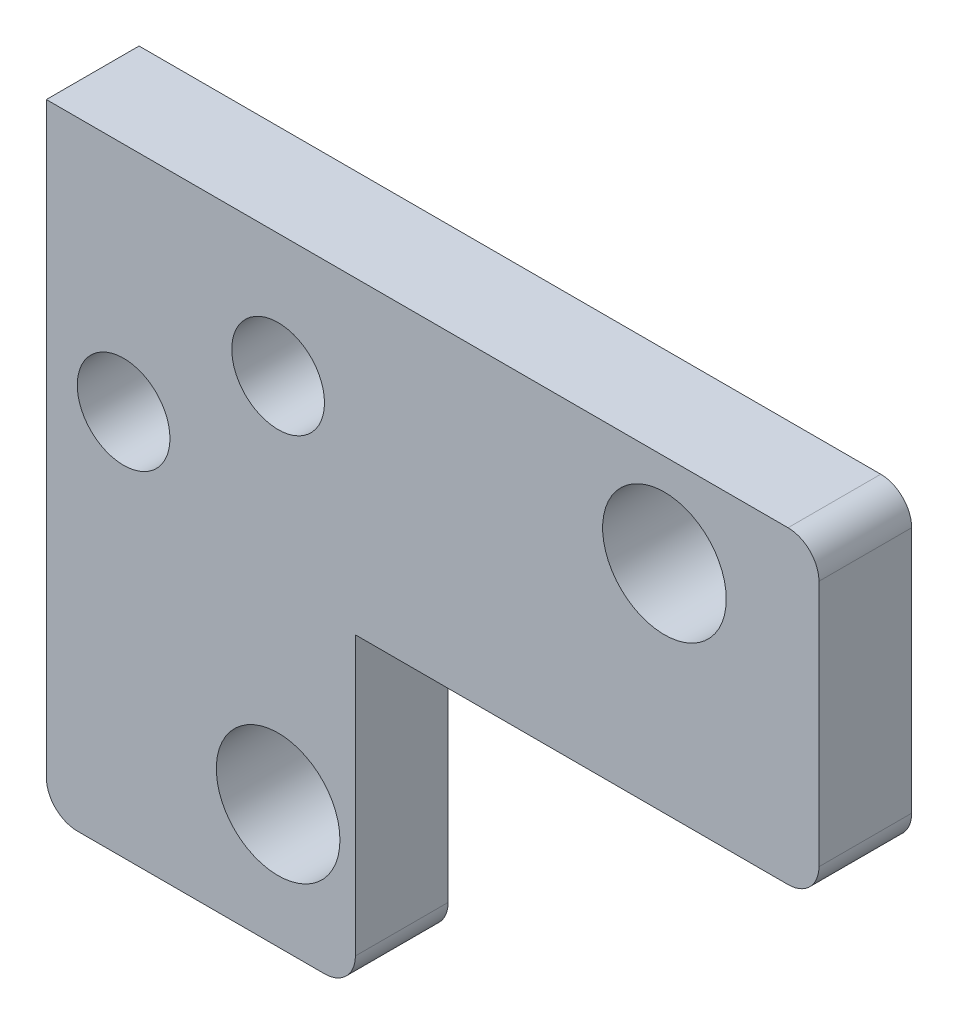
ISO-10303-21;
HEADER;
FILE_DESCRIPTION(('STEP AP214'),'2;1');
FILE_NAME('part.step','',(''),(''),'','','');
FILE_SCHEMA(('AUTOMOTIVE_DESIGN { 1 0 10303 214 1 1 1 1 }'));
ENDSEC;
DATA;
#1=APPLICATION_CONTEXT('core data for automotive mechanical design processes');
#2=APPLICATION_PROTOCOL_DEFINITION('international standard','automotive_design',2000,#1);
#3=PRODUCT_CONTEXT('',#1,'mechanical');
#4=PRODUCT('Part','Part','',(#3));
#5=PRODUCT_RELATED_PRODUCT_CATEGORY('part','',(#4));
#6=PRODUCT_DEFINITION_FORMATION('','',#4);
#7=PRODUCT_DEFINITION_CONTEXT('part definition',#1,'design');
#8=PRODUCT_DEFINITION('design','',#6,#7);
#9=PRODUCT_DEFINITION_SHAPE('','',#8);
#10=(LENGTH_UNIT() NAMED_UNIT(*) SI_UNIT(.MILLI.,.METRE.));
#11=(NAMED_UNIT(*) PLANE_ANGLE_UNIT() SI_UNIT($,.RADIAN.));
#12=(NAMED_UNIT(*) SI_UNIT($,.STERADIAN.) SOLID_ANGLE_UNIT());
#13=UNCERTAINTY_MEASURE_WITH_UNIT(LENGTH_MEASURE(1.E-05),#10,'distance_accuracy_value','');
#14=(GEOMETRIC_REPRESENTATION_CONTEXT(3) GLOBAL_UNCERTAINTY_ASSIGNED_CONTEXT((#13)) GLOBAL_UNIT_ASSIGNED_CONTEXT((#10,
#11,#12)) REPRESENTATION_CONTEXT('',''));
#15=CARTESIAN_POINT('',(0.,0.,0.));
#16=DIRECTION('',(0.,0.,1.));
#17=DIRECTION('',(1.,0.,0.));
#18=AXIS2_PLACEMENT_3D('',#15,#16,#17);
#19=CARTESIAN_POINT('',(0.,0.,3.));
#20=DIRECTION('',(0.,1.,0.));
#21=DIRECTION('',(0.,0.,1.));
#22=AXIS2_PLACEMENT_3D('',#19,#20,#21);
#23=PLANE('',#22);
#24=DIRECTION('',(1.,0.,0.));
#25=VECTOR('',#24,1.);
#26=CARTESIAN_POINT('',(0.,0.,0.));
#27=LINE('',#26,#25);
#28=CARTESIAN_POINT('',(10.,0.,0.));
#29=VERTEX_POINT('',#28);
#30=CARTESIAN_POINT('',(24.,0.,0.));
#31=VERTEX_POINT('',#30);
#32=EDGE_CURVE('E163',#29,#31,#27,.T.);
#33=ORIENTED_EDGE('',*,*,#32,.T.);
#34=DIRECTION('',(0.,0.,-1.));
#35=VECTOR('',#34,1.);
#36=CARTESIAN_POINT('',(24.,0.,3.));
#37=LINE('',#36,#35);
#38=CARTESIAN_POINT('',(24.,0.,3.));
#39=VERTEX_POINT('',#38);
#40=EDGE_CURVE('E11',#31,#39,#37,.F.);
#41=ORIENTED_EDGE('',*,*,#40,.T.);
#42=DIRECTION('',(1.,0.,0.));
#43=VECTOR('',#42,1.);
#44=CARTESIAN_POINT('',(0.,0.,3.));
#45=LINE('',#44,#43);
#46=CARTESIAN_POINT('',(10.,0.,3.));
#47=VERTEX_POINT('',#46);
#48=EDGE_CURVE('E116',#47,#39,#45,.T.);
#49=ORIENTED_EDGE('',*,*,#48,.F.);
#50=DIRECTION('',(0.,0.,1.));
#51=VECTOR('',#50,1.);
#52=CARTESIAN_POINT('',(10.,0.,0.));
#53=LINE('',#52,#51);
#54=EDGE_CURVE('E126',#29,#47,#53,.T.);
#55=ORIENTED_EDGE('',*,*,#54,.F.);
#56=EDGE_LOOP('',(#33,#41,#49,#55));
#57=FACE_BOUND('',#56,.T.);
#58=ADVANCED_FACE('F35',(#57),#23,.F.);
#59=CARTESIAN_POINT('',(0.,0.,3.));
#60=DIRECTION('',(1.,0.,0.));
#61=DIRECTION('',(0.,1.,0.));
#62=AXIS2_PLACEMENT_3D('',#59,#60,#61);
#63=PLANE('',#62);
#64=DIRECTION('',(0.,-1.,0.));
#65=VECTOR('',#64,1.);
#66=CARTESIAN_POINT('',(0.,0.,0.));
#67=LINE('',#66,#65);
#68=CARTESIAN_POINT('',(0.,10.,0.));
#69=VERTEX_POINT('',#68);
#70=CARTESIAN_POINT('',(0.,-9.,0.));
#71=VERTEX_POINT('',#70);
#72=EDGE_CURVE('E151',#69,#71,#67,.T.);
#73=ORIENTED_EDGE('',*,*,#72,.T.);
#74=DIRECTION('',(0.,0.,1.));
#75=VECTOR('',#74,1.);
#76=CARTESIAN_POINT('',(0.,-9.,3.));
#77=LINE('',#76,#75);
#78=CARTESIAN_POINT('',(0.,-9.,3.));
#79=VERTEX_POINT('',#78);
#80=EDGE_CURVE('E171',#71,#79,#77,.T.);
#81=ORIENTED_EDGE('',*,*,#80,.T.);
#82=DIRECTION('',(0.,-1.,0.));
#83=VECTOR('',#82,1.);
#84=CARTESIAN_POINT('',(0.,0.,3.));
#85=LINE('',#84,#83);
#86=CARTESIAN_POINT('',(0.,10.,3.));
#87=VERTEX_POINT('',#86);
#88=EDGE_CURVE('E129',#87,#79,#85,.T.);
#89=ORIENTED_EDGE('',*,*,#88,.F.);
#90=DIRECTION('',(0.,0.,-1.));
#91=VECTOR('',#90,1.);
#92=CARTESIAN_POINT('',(0.,10.,3.));
#93=LINE('',#92,#91);
#94=EDGE_CURVE('E160',#87,#69,#93,.T.);
#95=ORIENTED_EDGE('',*,*,#94,.T.);
#96=EDGE_LOOP('',(#73,#81,#89,#95));
#97=FACE_BOUND('',#96,.T.);
#98=ADVANCED_FACE('F221',(#97),#63,.F.);
#99=CARTESIAN_POINT('',(25.,0.,3.));
#100=DIRECTION('',(-1.,0.,0.));
#101=DIRECTION('',(0.,-1.,0.));
#102=AXIS2_PLACEMENT_3D('',#99,#100,#101);
#103=PLANE('',#102);
#104=DIRECTION('',(0.,1.,0.));
#105=VECTOR('',#104,1.);
#106=CARTESIAN_POINT('',(25.,0.,0.));
#107=LINE('',#106,#105);
#108=CARTESIAN_POINT('',(25.,1.,0.));
#109=VERTEX_POINT('',#108);
#110=CARTESIAN_POINT('',(25.,9.,0.));
#111=VERTEX_POINT('',#110);
#112=EDGE_CURVE('E165',#109,#111,#107,.T.);
#113=ORIENTED_EDGE('',*,*,#112,.T.);
#114=DIRECTION('',(0.,0.,-1.));
#115=VECTOR('',#114,1.);
#116=CARTESIAN_POINT('',(25.,9.,3.));
#117=LINE('',#116,#115);
#118=CARTESIAN_POINT('',(25.,9.,3.));
#119=VERTEX_POINT('',#118);
#120=EDGE_CURVE('E43',#111,#119,#117,.F.);
#121=ORIENTED_EDGE('',*,*,#120,.T.);
#122=DIRECTION('',(0.,1.,0.));
#123=VECTOR('',#122,1.);
#124=CARTESIAN_POINT('',(25.,0.,3.));
#125=LINE('',#124,#123);
#126=CARTESIAN_POINT('',(25.,1.,3.));
#127=VERTEX_POINT('',#126);
#128=EDGE_CURVE('E128',#127,#119,#125,.T.);
#129=ORIENTED_EDGE('',*,*,#128,.F.);
#130=DIRECTION('',(0.,0.,-1.));
#131=VECTOR('',#130,1.);
#132=CARTESIAN_POINT('',(25.,1.,3.));
#133=LINE('',#132,#131);
#134=EDGE_CURVE('E199',#127,#109,#133,.T.);
#135=ORIENTED_EDGE('',*,*,#134,.T.);
#136=EDGE_LOOP('',(#113,#121,#129,#135));
#137=FACE_BOUND('',#136,.T.);
#138=ADVANCED_FACE('F204',(#137),#103,.F.);
#139=CARTESIAN_POINT('',(0.,10.,3.));
#140=DIRECTION('',(0.,-1.,0.));
#141=DIRECTION('',(0.,0.,-1.));
#142=AXIS2_PLACEMENT_3D('',#139,#140,#141);
#143=PLANE('',#142);
#144=DIRECTION('',(-1.,0.,0.));
#145=VECTOR('',#144,1.);
#146=CARTESIAN_POINT('',(0.,10.,3.));
#147=LINE('',#146,#145);
#148=CARTESIAN_POINT('',(24.,10.,3.));
#149=VERTEX_POINT('',#148);
#150=EDGE_CURVE('E158',#149,#87,#147,.T.);
#151=ORIENTED_EDGE('',*,*,#150,.F.);
#152=DIRECTION('',(0.,0.,-1.));
#153=VECTOR('',#152,1.);
#154=CARTESIAN_POINT('',(24.,10.,3.));
#155=LINE('',#154,#153);
#156=CARTESIAN_POINT('',(24.,10.,0.));
#157=VERTEX_POINT('',#156);
#158=EDGE_CURVE('E196',#149,#157,#155,.T.);
#159=ORIENTED_EDGE('',*,*,#158,.T.);
#160=DIRECTION('',(-1.,0.,0.));
#161=VECTOR('',#160,1.);
#162=CARTESIAN_POINT('',(0.,10.,0.));
#163=LINE('',#162,#161);
#164=EDGE_CURVE('E154',#157,#69,#163,.T.);
#165=ORIENTED_EDGE('',*,*,#164,.T.);
#166=ORIENTED_EDGE('',*,*,#94,.F.);
#167=EDGE_LOOP('',(#151,#159,#165,#166));
#168=FACE_BOUND('',#167,.T.);
#169=ADVANCED_FACE('F213',(#168),#143,.F.);
#170=CARTESIAN_POINT('',(0.,0.,3.));
#171=DIRECTION('',(0.,0.,-1.));
#172=DIRECTION('',(-1.,0.,0.));
#173=AXIS2_PLACEMENT_3D('',#170,#171,#172);
#174=PLANE('',#173);
#175=CARTESIAN_POINT('',(7.5,-6.,3.));
#176=DIRECTION('',(0.,0.,1.));
#177=DIRECTION('',(1.,0.,0.));
#178=AXIS2_PLACEMENT_3D('',#175,#176,#177);
#179=CIRCLE('',#178,2.);
#180=CARTESIAN_POINT('',(9.5,-6.,3.));
#181=VERTEX_POINT('',#180);
#182=EDGE_CURVE('E233',#181,#181,#179,.T.);
#183=ORIENTED_EDGE('',*,*,#182,.F.);
#184=EDGE_LOOP('',(#183));
#185=FACE_BOUND('',#184,.T.);
#186=CARTESIAN_POINT('',(20.,7.,3.));
#187=DIRECTION('',(0.,0.,1.));
#188=DIRECTION('',(1.,0.,0.));
#189=AXIS2_PLACEMENT_3D('',#186,#187,#188);
#190=CIRCLE('',#189,2.);
#191=CARTESIAN_POINT('',(22.,7.,3.));
#192=VERTEX_POINT('',#191);
#193=EDGE_CURVE('E133',#192,#192,#190,.T.);
#194=ORIENTED_EDGE('',*,*,#193,.F.);
#195=EDGE_LOOP('',(#194));
#196=FACE_BOUND('',#195,.T.);
#197=CARTESIAN_POINT('',(7.49999999999999,6.,3.));
#198=DIRECTION('',(0.,0.,1.));
#199=DIRECTION('',(1.,0.,0.));
#200=AXIS2_PLACEMENT_3D('',#197,#198,#199);
#201=CIRCLE('',#200,1.5);
#202=CARTESIAN_POINT('',(8.99999999999999,6.,3.));
#203=VERTEX_POINT('',#202);
#204=EDGE_CURVE('E145',#203,#203,#201,.T.);
#205=ORIENTED_EDGE('',*,*,#204,.F.);
#206=EDGE_LOOP('',(#205));
#207=FACE_BOUND('',#206,.T.);
#208=CARTESIAN_POINT('',(2.49999999999999,2.5,3.));
#209=DIRECTION('',(0.,0.,1.));
#210=DIRECTION('',(1.,0.,0.));
#211=AXIS2_PLACEMENT_3D('',#208,#209,#210);
#212=CIRCLE('',#211,1.5);
#213=CARTESIAN_POINT('',(3.99999999999999,2.5,3.));
#214=VERTEX_POINT('',#213);
#215=EDGE_CURVE('E144',#214,#214,#212,.T.);
#216=ORIENTED_EDGE('',*,*,#215,.F.);
#217=EDGE_LOOP('',(#216));
#218=FACE_BOUND('',#217,.T.);
#219=ORIENTED_EDGE('',*,*,#88,.T.);
#220=CARTESIAN_POINT('',(1.00000000000001,-9.,3.));
#221=DIRECTION('',(0.,0.,-1.));
#222=DIRECTION('',(-1.,0.,0.));
#223=AXIS2_PLACEMENT_3D('',#220,#221,#222);
#224=CIRCLE('',#223,1.);
#225=CARTESIAN_POINT('',(1.00000000000001,-10.,3.));
#226=VERTEX_POINT('',#225);
#227=EDGE_CURVE('E181',#79,#226,#224,.F.);
#228=ORIENTED_EDGE('',*,*,#227,.T.);
#229=DIRECTION('',(1.,0.,0.));
#230=VECTOR('',#229,1.);
#231=CARTESIAN_POINT('',(0.,-10.,3.));
#232=LINE('',#231,#230);
#233=CARTESIAN_POINT('',(9.,-10.,3.));
#234=VERTEX_POINT('',#233);
#235=EDGE_CURVE('E122',#226,#234,#232,.T.);
#236=ORIENTED_EDGE('',*,*,#235,.T.);
#237=CARTESIAN_POINT('',(9.,-9.,3.));
#238=DIRECTION('',(0.,0.,-1.));
#239=DIRECTION('',(-1.,0.,0.));
#240=AXIS2_PLACEMENT_3D('',#237,#238,#239);
#241=CIRCLE('',#240,1.);
#242=CARTESIAN_POINT('',(10.,-9.,3.));
#243=VERTEX_POINT('',#242);
#244=EDGE_CURVE('E119',#234,#243,#241,.F.);
#245=ORIENTED_EDGE('',*,*,#244,.T.);
#246=DIRECTION('',(0.,1.,0.));
#247=VECTOR('',#246,1.);
#248=CARTESIAN_POINT('',(10.,0.,3.));
#249=LINE('',#248,#247);
#250=EDGE_CURVE('E112',#243,#47,#249,.T.);
#251=ORIENTED_EDGE('',*,*,#250,.T.);
#252=ORIENTED_EDGE('',*,*,#48,.T.);
#253=CARTESIAN_POINT('',(24.,1.,3.));
#254=DIRECTION('',(0.,0.,-1.));
#255=DIRECTION('',(-1.,0.,0.));
#256=AXIS2_PLACEMENT_3D('',#253,#254,#255);
#257=CIRCLE('',#256,1.);
#258=EDGE_CURVE('E176',#39,#127,#257,.F.);
#259=ORIENTED_EDGE('',*,*,#258,.T.);
#260=ORIENTED_EDGE('',*,*,#128,.T.);
#261=CARTESIAN_POINT('',(24.,9.,3.));
#262=DIRECTION('',(0.,0.,-1.));
#263=DIRECTION('',(-1.,0.,0.));
#264=AXIS2_PLACEMENT_3D('',#261,#262,#263);
#265=CIRCLE('',#264,1.);
#266=EDGE_CURVE('E178',#119,#149,#265,.F.);
#267=ORIENTED_EDGE('',*,*,#266,.T.);
#268=ORIENTED_EDGE('',*,*,#150,.T.);
#269=EDGE_LOOP('',(#219,#228,#236,#245,#251,#252,#259,#260,#267,#268));
#270=FACE_BOUND('',#269,.T.);
#271=ADVANCED_FACE('F115',(#185,#196,#207,#218,#270),#174,.F.);
#272=CARTESIAN_POINT('',(0.,0.,0.));
#273=DIRECTION('',(0.,0.,-1.));
#274=DIRECTION('',(-1.,0.,0.));
#275=AXIS2_PLACEMENT_3D('',#272,#273,#274);
#276=PLANE('',#275);
#277=CARTESIAN_POINT('',(7.5,-6.,0.));
#278=DIRECTION('',(0.,0.,1.));
#279=DIRECTION('',(1.,0.,0.));
#280=AXIS2_PLACEMENT_3D('',#277,#278,#279);
#281=CIRCLE('',#280,2.);
#282=CARTESIAN_POINT('',(9.5,-6.,0.));
#283=VERTEX_POINT('',#282);
#284=EDGE_CURVE('E231',#283,#283,#281,.T.);
#285=ORIENTED_EDGE('',*,*,#284,.T.);
#286=EDGE_LOOP('',(#285));
#287=FACE_BOUND('',#286,.T.);
#288=CARTESIAN_POINT('',(20.,7.,0.));
#289=DIRECTION('',(0.,0.,-1.));
#290=DIRECTION('',(-1.,0.,0.));
#291=AXIS2_PLACEMENT_3D('',#288,#289,#290);
#292=CIRCLE('',#291,2.);
#293=CARTESIAN_POINT('',(18.,7.,0.));
#294=VERTEX_POINT('',#293);
#295=EDGE_CURVE('E136',#294,#294,#292,.T.);
#296=ORIENTED_EDGE('',*,*,#295,.F.);
#297=EDGE_LOOP('',(#296));
#298=FACE_BOUND('',#297,.T.);
#299=CARTESIAN_POINT('',(7.49999999999999,6.,0.));
#300=DIRECTION('',(0.,0.,1.));
#301=DIRECTION('',(1.,0.,0.));
#302=AXIS2_PLACEMENT_3D('',#299,#300,#301);
#303=CIRCLE('',#302,1.5);
#304=CARTESIAN_POINT('',(8.99999999999999,6.,0.));
#305=VERTEX_POINT('',#304);
#306=EDGE_CURVE('E141',#305,#305,#303,.T.);
#307=ORIENTED_EDGE('',*,*,#306,.T.);
#308=EDGE_LOOP('',(#307));
#309=FACE_BOUND('',#308,.T.);
#310=CARTESIAN_POINT('',(2.49999999999999,2.5,0.));
#311=DIRECTION('',(0.,0.,1.));
#312=DIRECTION('',(1.,0.,0.));
#313=AXIS2_PLACEMENT_3D('',#310,#311,#312);
#314=CIRCLE('',#313,1.5);
#315=CARTESIAN_POINT('',(3.99999999999999,2.5,0.));
#316=VERTEX_POINT('',#315);
#317=EDGE_CURVE('E148',#316,#316,#314,.T.);
#318=ORIENTED_EDGE('',*,*,#317,.T.);
#319=EDGE_LOOP('',(#318));
#320=FACE_BOUND('',#319,.T.);
#321=DIRECTION('',(1.,0.,0.));
#322=VECTOR('',#321,1.);
#323=CARTESIAN_POINT('',(0.,-10.,0.));
#324=LINE('',#323,#322);
#325=CARTESIAN_POINT('',(1.00000000000001,-10.,0.));
#326=VERTEX_POINT('',#325);
#327=CARTESIAN_POINT('',(9.,-10.,0.));
#328=VERTEX_POINT('',#327);
#329=EDGE_CURVE('E121',#326,#328,#324,.T.);
#330=ORIENTED_EDGE('',*,*,#329,.F.);
#331=CARTESIAN_POINT('',(1.00000000000001,-9.,0.));
#332=DIRECTION('',(0.,0.,-1.));
#333=DIRECTION('',(-1.,0.,0.));
#334=AXIS2_PLACEMENT_3D('',#331,#332,#333);
#335=CIRCLE('',#334,1.);
#336=EDGE_CURVE('E193',#326,#71,#335,.T.);
#337=ORIENTED_EDGE('',*,*,#336,.T.);
#338=ORIENTED_EDGE('',*,*,#72,.F.);
#339=ORIENTED_EDGE('',*,*,#164,.F.);
#340=CARTESIAN_POINT('',(24.,9.,0.));
#341=DIRECTION('',(0.,0.,-1.));
#342=DIRECTION('',(-1.,0.,0.));
#343=AXIS2_PLACEMENT_3D('',#340,#341,#342);
#344=CIRCLE('',#343,1.);
#345=EDGE_CURVE('E189',#157,#111,#344,.T.);
#346=ORIENTED_EDGE('',*,*,#345,.T.);
#347=ORIENTED_EDGE('',*,*,#112,.F.);
#348=CARTESIAN_POINT('',(24.,1.,0.));
#349=DIRECTION('',(0.,0.,-1.));
#350=DIRECTION('',(-1.,0.,0.));
#351=AXIS2_PLACEMENT_3D('',#348,#349,#350);
#352=CIRCLE('',#351,1.);
#353=EDGE_CURVE('E58',#109,#31,#352,.T.);
#354=ORIENTED_EDGE('',*,*,#353,.T.);
#355=ORIENTED_EDGE('',*,*,#32,.F.);
#356=DIRECTION('',(0.,1.,0.));
#357=VECTOR('',#356,1.);
#358=CARTESIAN_POINT('',(10.,0.,0.));
#359=LINE('',#358,#357);
#360=CARTESIAN_POINT('',(10.,-9.,0.));
#361=VERTEX_POINT('',#360);
#362=EDGE_CURVE('E132',#361,#29,#359,.T.);
#363=ORIENTED_EDGE('',*,*,#362,.F.);
#364=CARTESIAN_POINT('',(9.,-9.,0.));
#365=DIRECTION('',(0.,0.,-1.));
#366=DIRECTION('',(-1.,0.,0.));
#367=AXIS2_PLACEMENT_3D('',#364,#365,#366);
#368=CIRCLE('',#367,1.);
#369=EDGE_CURVE('E191',#361,#328,#368,.T.);
#370=ORIENTED_EDGE('',*,*,#369,.T.);
#371=EDGE_LOOP('',(#330,#337,#338,#339,#346,#347,#354,#355,#363,#370));
#372=FACE_BOUND('',#371,.T.);
#373=ADVANCED_FACE('F217',(#287,#298,#309,#320,#372),#276,.T.);
#374=CARTESIAN_POINT('',(2.49999999999999,2.5,0.));
#375=DIRECTION('',(0.,0.,1.));
#376=DIRECTION('',(1.,0.,0.));
#377=AXIS2_PLACEMENT_3D('',#374,#375,#376);
#378=CYLINDRICAL_SURFACE('',#377,1.5);
#379=ORIENTED_EDGE('',*,*,#317,.F.);
#380=EDGE_LOOP('',(#379));
#381=FACE_BOUND('',#380,.T.);
#382=ORIENTED_EDGE('',*,*,#215,.T.);
#383=EDGE_LOOP('',(#382));
#384=FACE_BOUND('',#383,.T.);
#385=ADVANCED_FACE('F251',(#381,#384),#378,.F.);
#386=CARTESIAN_POINT('',(7.49999999999999,6.,0.));
#387=DIRECTION('',(0.,0.,1.));
#388=DIRECTION('',(1.,0.,0.));
#389=AXIS2_PLACEMENT_3D('',#386,#387,#388);
#390=CYLINDRICAL_SURFACE('',#389,1.5);
#391=ORIENTED_EDGE('',*,*,#306,.F.);
#392=EDGE_LOOP('',(#391));
#393=FACE_BOUND('',#392,.T.);
#394=ORIENTED_EDGE('',*,*,#204,.T.);
#395=EDGE_LOOP('',(#394));
#396=FACE_BOUND('',#395,.T.);
#397=ADVANCED_FACE('F253',(#393,#396),#390,.F.);
#398=CARTESIAN_POINT('',(20.,7.,-7.));
#399=DIRECTION('',(0.,0.,1.));
#400=DIRECTION('',(1.,0.,0.));
#401=AXIS2_PLACEMENT_3D('',#398,#399,#400);
#402=CYLINDRICAL_SURFACE('',#401,2.);
#403=ORIENTED_EDGE('',*,*,#295,.T.);
#404=EDGE_LOOP('',(#403));
#405=FACE_BOUND('',#404,.T.);
#406=ORIENTED_EDGE('',*,*,#193,.T.);
#407=EDGE_LOOP('',(#406));
#408=FACE_BOUND('',#407,.T.);
#409=ADVANCED_FACE('F260',(#405,#408),#402,.F.);
#410=CARTESIAN_POINT('',(10.,0.,0.));
#411=DIRECTION('',(1.,0.,0.));
#412=DIRECTION('',(0.,1.,0.));
#413=AXIS2_PLACEMENT_3D('',#410,#411,#412);
#414=PLANE('',#413);
#415=ORIENTED_EDGE('',*,*,#250,.F.);
#416=DIRECTION('',(0.,0.,1.));
#417=VECTOR('',#416,1.);
#418=CARTESIAN_POINT('',(10.,-9.,0.));
#419=LINE('',#418,#417);
#420=EDGE_CURVE('E50',#243,#361,#419,.F.);
#421=ORIENTED_EDGE('',*,*,#420,.T.);
#422=ORIENTED_EDGE('',*,*,#362,.T.);
#423=ORIENTED_EDGE('',*,*,#54,.T.);
#424=EDGE_LOOP('',(#415,#421,#422,#423));
#425=FACE_BOUND('',#424,.T.);
#426=ADVANCED_FACE('F131',(#425),#414,.T.);
#427=CARTESIAN_POINT('',(0.,-10.,0.));
#428=DIRECTION('',(0.,-1.,0.));
#429=DIRECTION('',(0.,0.,-1.));
#430=AXIS2_PLACEMENT_3D('',#427,#428,#429);
#431=PLANE('',#430);
#432=ORIENTED_EDGE('',*,*,#235,.F.);
#433=DIRECTION('',(0.,0.,1.));
#434=VECTOR('',#433,1.);
#435=CARTESIAN_POINT('',(1.00000000000001,-10.,0.));
#436=LINE('',#435,#434);
#437=EDGE_CURVE('E186',#226,#326,#436,.F.);
#438=ORIENTED_EDGE('',*,*,#437,.T.);
#439=ORIENTED_EDGE('',*,*,#329,.T.);
#440=DIRECTION('',(0.,0.,1.));
#441=VECTOR('',#440,1.);
#442=CARTESIAN_POINT('',(9.,-10.,0.));
#443=LINE('',#442,#441);
#444=EDGE_CURVE('E183',#328,#234,#443,.T.);
#445=ORIENTED_EDGE('',*,*,#444,.T.);
#446=EDGE_LOOP('',(#432,#438,#439,#445));
#447=FACE_BOUND('',#446,.T.);
#448=ADVANCED_FACE('F228',(#447),#431,.T.);
#449=CARTESIAN_POINT('',(7.5,-6.,0.));
#450=DIRECTION('',(0.,0.,1.));
#451=DIRECTION('',(1.,0.,0.));
#452=AXIS2_PLACEMENT_3D('',#449,#450,#451);
#453=CYLINDRICAL_SURFACE('',#452,2.);
#454=ORIENTED_EDGE('',*,*,#284,.F.);
#455=EDGE_LOOP('',(#454));
#456=FACE_BOUND('',#455,.T.);
#457=ORIENTED_EDGE('',*,*,#182,.T.);
#458=EDGE_LOOP('',(#457));
#459=FACE_BOUND('',#458,.T.);
#460=ADVANCED_FACE('F240',(#456,#459),#453,.F.);
#461=CARTESIAN_POINT('',(1.00000000000001,-9.,3.));
#462=DIRECTION('',(0.,0.,-1.));
#463=DIRECTION('',(-1.,0.,0.));
#464=AXIS2_PLACEMENT_3D('',#461,#462,#463);
#465=CYLINDRICAL_SURFACE('',#464,1.);
#466=ORIENTED_EDGE('',*,*,#336,.F.);
#467=ORIENTED_EDGE('',*,*,#437,.F.);
#468=ORIENTED_EDGE('',*,*,#227,.F.);
#469=ORIENTED_EDGE('',*,*,#80,.F.);
#470=EDGE_LOOP('',(#466,#467,#468,#469));
#471=FACE_BOUND('',#470,.T.);
#472=ADVANCED_FACE('F224',(#471),#465,.T.);
#473=CARTESIAN_POINT('',(9.,-9.,0.));
#474=DIRECTION('',(0.,0.,1.));
#475=DIRECTION('',(1.,0.,0.));
#476=AXIS2_PLACEMENT_3D('',#473,#474,#475);
#477=CYLINDRICAL_SURFACE('',#476,1.);
#478=ORIENTED_EDGE('',*,*,#369,.F.);
#479=ORIENTED_EDGE('',*,*,#420,.F.);
#480=ORIENTED_EDGE('',*,*,#244,.F.);
#481=ORIENTED_EDGE('',*,*,#444,.F.);
#482=EDGE_LOOP('',(#478,#479,#480,#481));
#483=FACE_BOUND('',#482,.T.);
#484=ADVANCED_FACE('F279',(#483),#477,.T.);
#485=CARTESIAN_POINT('',(24.,9.,3.));
#486=DIRECTION('',(0.,0.,-1.));
#487=DIRECTION('',(-1.,0.,0.));
#488=AXIS2_PLACEMENT_3D('',#485,#486,#487);
#489=CYLINDRICAL_SURFACE('',#488,1.);
#490=ORIENTED_EDGE('',*,*,#266,.F.);
#491=ORIENTED_EDGE('',*,*,#120,.F.);
#492=ORIENTED_EDGE('',*,*,#345,.F.);
#493=ORIENTED_EDGE('',*,*,#158,.F.);
#494=EDGE_LOOP('',(#490,#491,#492,#493));
#495=FACE_BOUND('',#494,.T.);
#496=ADVANCED_FACE('F210',(#495),#489,.T.);
#497=CARTESIAN_POINT('',(24.,1.,3.));
#498=DIRECTION('',(0.,0.,-1.));
#499=DIRECTION('',(-1.,0.,0.));
#500=AXIS2_PLACEMENT_3D('',#497,#498,#499);
#501=CYLINDRICAL_SURFACE('',#500,1.);
#502=ORIENTED_EDGE('',*,*,#258,.F.);
#503=ORIENTED_EDGE('',*,*,#40,.F.);
#504=ORIENTED_EDGE('',*,*,#353,.F.);
#505=ORIENTED_EDGE('',*,*,#134,.F.);
#506=EDGE_LOOP('',(#502,#503,#504,#505));
#507=FACE_BOUND('',#506,.T.);
#508=ADVANCED_FACE('F37',(#507),#501,.T.);
#509=CLOSED_SHELL('',(#58,#98,#138,#169,#271,#373,#385,#397,#409,#426,#448,#460,#472,#484,#496,#508));
#510=MANIFOLD_SOLID_BREP('B2',#509);
#511=ADVANCED_BREP_SHAPE_REPRESENTATION('',(#18,#510),#14);
#512=SHAPE_DEFINITION_REPRESENTATION(#9,#511);
ENDSEC;
END-ISO-10303-21;
